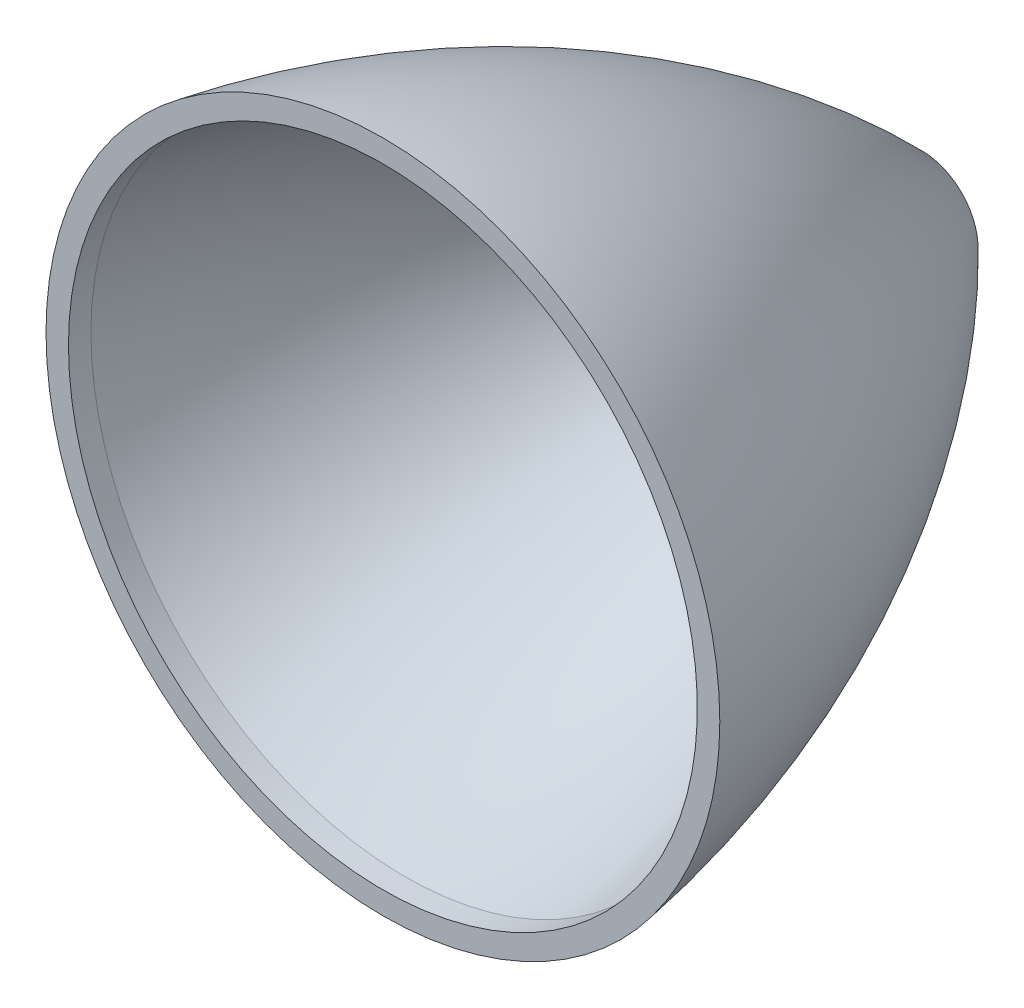
ISO-10303-21;
HEADER;
FILE_DESCRIPTION(('STEP AP214'),'2;1');
FILE_NAME('part.step','',(''),(''),'','','');
FILE_SCHEMA(('AUTOMOTIVE_DESIGN { 1 0 10303 214 1 1 1 1 }'));
ENDSEC;
DATA;
#1=APPLICATION_CONTEXT('core data for automotive mechanical design processes');
#2=APPLICATION_PROTOCOL_DEFINITION('international standard','automotive_design',2000,#1);
#3=PRODUCT_CONTEXT('',#1,'mechanical');
#4=PRODUCT('Part','Part','',(#3));
#5=PRODUCT_RELATED_PRODUCT_CATEGORY('part','',(#4));
#6=PRODUCT_DEFINITION_FORMATION('','',#4);
#7=PRODUCT_DEFINITION_CONTEXT('part definition',#1,'design');
#8=PRODUCT_DEFINITION('design','',#6,#7);
#9=PRODUCT_DEFINITION_SHAPE('','',#8);
#10=(LENGTH_UNIT() NAMED_UNIT(*) SI_UNIT(.MILLI.,.METRE.));
#11=(NAMED_UNIT(*) PLANE_ANGLE_UNIT() SI_UNIT($,.RADIAN.));
#12=(NAMED_UNIT(*) SI_UNIT($,.STERADIAN.) SOLID_ANGLE_UNIT());
#13=UNCERTAINTY_MEASURE_WITH_UNIT(LENGTH_MEASURE(1.E-05),#10,'distance_accuracy_value','');
#14=(GEOMETRIC_REPRESENTATION_CONTEXT(3) GLOBAL_UNCERTAINTY_ASSIGNED_CONTEXT((#13)) GLOBAL_UNIT_ASSIGNED_CONTEXT((#10,
#11,#12)) REPRESENTATION_CONTEXT('',''));
#15=CARTESIAN_POINT('',(0.,0.,0.));
#16=DIRECTION('',(0.,0.,1.));
#17=DIRECTION('',(1.,0.,0.));
#18=AXIS2_PLACEMENT_3D('',#15,#16,#17);
#19=CARTESIAN_POINT('',(0.,1.5,3.81018259712039));
#20=DIRECTION('',(0.,0.,1.));
#21=DIRECTION('',(1.,0.,0.));
#22=AXIS2_PLACEMENT_3D('',#19,#20,#21);
#23=PLANE('',#22);
#24=CARTESIAN_POINT('',(0.,0.,3.81018259712039));
#25=DIRECTION('',(0.,0.,-1.));
#26=DIRECTION('',(-1.,0.,0.));
#27=AXIS2_PLACEMENT_3D('',#24,#25,#26);
#28=CIRCLE('',#27,1.5);
#29=CARTESIAN_POINT('',(-1.5,0.,3.81018259712039));
#30=VERTEX_POINT('',#29);
#31=EDGE_CURVE('E36',#30,#30,#28,.T.);
#32=ORIENTED_EDGE('',*,*,#31,.T.);
#33=EDGE_LOOP('',(#32));
#34=FACE_BOUND('',#33,.T.);
#35=CARTESIAN_POINT('',(0.,0.,3.81018259712039));
#36=DIRECTION('',(0.,0.,-1.));
#37=DIRECTION('',(-1.,0.,0.));
#38=AXIS2_PLACEMENT_3D('',#35,#36,#37);
#39=CIRCLE('',#38,4.00000000000001);
#40=CARTESIAN_POINT('',(-4.00000000000001,0.,3.81018259712039));
#41=VERTEX_POINT('',#40);
#42=EDGE_CURVE('E18',#41,#41,#39,.F.);
#43=ORIENTED_EDGE('',*,*,#42,.T.);
#44=EDGE_LOOP('',(#43));
#45=FACE_BOUND('',#44,.T.);
#46=ADVANCED_FACE('F15',(#34,#45),#23,.T.);
#47=CARTESIAN_POINT('',(0.,0.,31.8359782136435));
#48=DIRECTION('',(0.,0.,-1.));
#49=DIRECTION('',(-1.,0.,0.));
#50=AXIS2_PLACEMENT_3D('',#47,#48,#49);
#51=DEGENERATE_TOROIDAL_SURFACE('',#50,26.421531561807,41.363205902168,.F.);
#52=CARTESIAN_POINT('',(0.,0.,23.0601825971204));
#53=DIRECTION('',(0.,0.,-1.));
#54=DIRECTION('',(-1.,0.,0.));
#55=AXIS2_PLACEMENT_3D('',#52,#53,#54);
#56=CIRCLE('',#55,14.);
#57=CARTESIAN_POINT('',(-14.,0.,23.0601825971204));
#58=VERTEX_POINT('',#57);
#59=EDGE_CURVE('E30',#58,#58,#56,.F.);
#60=ORIENTED_EDGE('',*,*,#59,.T.);
#61=EDGE_LOOP('',(#60));
#62=FACE_BOUND('',#61,.T.);
#63=ORIENTED_EDGE('',*,*,#42,.F.);
#64=EDGE_LOOP('',(#63));
#65=FACE_BOUND('',#64,.T.);
#66=ADVANCED_FACE('F45',(#62,#65),#51,.T.);
#67=CARTESIAN_POINT('',(0.,0.,-3.97927021276701));
#68=DIRECTION('',(0.,0.,-1.));
#69=DIRECTION('',(-1.,0.,0.));
#70=AXIS2_PLACEMENT_3D('',#67,#68,#69);
#71=CYLINDRICAL_SURFACE('',#70,1.5);
#72=CARTESIAN_POINT('',(0.,0.,0.0601825971203885));
#73=DIRECTION('',(0.,0.,-1.));
#74=DIRECTION('',(-1.,0.,0.));
#75=AXIS2_PLACEMENT_3D('',#72,#73,#74);
#76=CIRCLE('',#75,1.5);
#77=CARTESIAN_POINT('',(-1.5,0.,0.0601825971203885));
#78=VERTEX_POINT('',#77);
#79=EDGE_CURVE('E34',#78,#78,#76,.F.);
#80=ORIENTED_EDGE('',*,*,#79,.F.);
#81=EDGE_LOOP('',(#80));
#82=FACE_BOUND('',#81,.T.);
#83=ORIENTED_EDGE('',*,*,#31,.F.);
#84=EDGE_LOOP('',(#83));
#85=FACE_BOUND('',#84,.T.);
#86=ADVANCED_FACE('F47',(#82,#85),#71,.F.);
#87=CARTESIAN_POINT('',(0.,0.,-3.97927021276701));
#88=DIRECTION('',(0.,0.,-1.));
#89=DIRECTION('',(-1.,0.,0.));
#90=AXIS2_PLACEMENT_3D('',#87,#88,#89);
#91=CYLINDRICAL_SURFACE('',#90,14.);
#92=ORIENTED_EDGE('',*,*,#59,.F.);
#93=EDGE_LOOP('',(#92));
#94=FACE_BOUND('',#93,.T.);
#95=CARTESIAN_POINT('',(0.,0.,24.0601825971204));
#96=DIRECTION('',(0.,0.,-1.));
#97=DIRECTION('',(-1.,0.,0.));
#98=AXIS2_PLACEMENT_3D('',#95,#96,#97);
#99=CIRCLE('',#98,14.);
#100=CARTESIAN_POINT('',(-14.,0.,24.0601825971204));
#101=VERTEX_POINT('',#100);
#102=EDGE_CURVE('E27',#101,#101,#99,.T.);
#103=ORIENTED_EDGE('',*,*,#102,.F.);
#104=EDGE_LOOP('',(#103));
#105=FACE_BOUND('',#104,.T.);
#106=ADVANCED_FACE('F54',(#94,#105),#91,.F.);
#107=CARTESIAN_POINT('',(0.,1.5,0.0601825971203885));
#108=DIRECTION('',(0.,0.,-1.));
#109=DIRECTION('',(-1.,0.,0.));
#110=AXIS2_PLACEMENT_3D('',#107,#108,#109);
#111=PLANE('',#110);
#112=ORIENTED_EDGE('',*,*,#79,.T.);
#113=EDGE_LOOP('',(#112));
#114=FACE_BOUND('',#113,.T.);
#115=CARTESIAN_POINT('',(0.,0.,0.0601825971204249));
#116=DIRECTION('',(0.,0.,-1.));
#117=DIRECTION('',(-1.,0.,0.));
#118=AXIS2_PLACEMENT_3D('',#115,#116,#117);
#119=CIRCLE('',#118,2.49999999999997);
#120=CARTESIAN_POINT('',(-2.49999999999997,0.,0.0601825971204249));
#121=VERTEX_POINT('',#120);
#122=EDGE_CURVE('E22',#121,#121,#119,.F.);
#123=ORIENTED_EDGE('',*,*,#122,.F.);
#124=EDGE_LOOP('',(#123));
#125=FACE_BOUND('',#124,.T.);
#126=ADVANCED_FACE('F64',(#114,#125),#111,.T.);
#127=CARTESIAN_POINT('',(0.,14.,24.0601825971204));
#128=DIRECTION('',(0.,0.,1.));
#129=DIRECTION('',(1.,0.,0.));
#130=AXIS2_PLACEMENT_3D('',#127,#128,#129);
#131=PLANE('',#130);
#132=ORIENTED_EDGE('',*,*,#102,.T.);
#133=EDGE_LOOP('',(#132));
#134=FACE_BOUND('',#133,.T.);
#135=CARTESIAN_POINT('',(0.,0.,24.0601825971204));
#136=DIRECTION('',(0.,0.,-1.));
#137=DIRECTION('',(-1.,0.,0.));
#138=AXIS2_PLACEMENT_3D('',#135,#136,#137);
#139=CIRCLE('',#138,15.);
#140=CARTESIAN_POINT('',(-15.,0.,24.0601825971204));
#141=VERTEX_POINT('',#140);
#142=EDGE_CURVE('E10',#141,#141,#139,.T.);
#143=ORIENTED_EDGE('',*,*,#142,.F.);
#144=EDGE_LOOP('',(#143));
#145=FACE_BOUND('',#144,.T.);
#146=ADVANCED_FACE('F59',(#134,#145),#131,.T.);
#147=CARTESIAN_POINT('',(0.,0.,31.1104339021616));
#148=DIRECTION('',(0.,0.,-1.));
#149=DIRECTION('',(-1.,0.,0.));
#150=AXIS2_PLACEMENT_3D('',#147,#148,#149);
#151=DEGENERATE_TOROIDAL_SURFACE('',#150,27.8264825056791,43.4029221052393,.F.);
#152=ORIENTED_EDGE('',*,*,#142,.T.);
#153=EDGE_LOOP('',(#152));
#154=FACE_BOUND('',#153,.T.);
#155=ORIENTED_EDGE('',*,*,#122,.T.);
#156=EDGE_LOOP('',(#155));
#157=FACE_BOUND('',#156,.T.);
#158=ADVANCED_FACE('F57',(#154,#157),#151,.F.);
#159=CLOSED_SHELL('',(#46,#66,#86,#106,#126,#146,#158));
#160=MANIFOLD_SOLID_BREP('B1',#159);
#161=ADVANCED_BREP_SHAPE_REPRESENTATION('',(#18,#160),#14);
#162=SHAPE_DEFINITION_REPRESENTATION(#9,#161);
ENDSEC;
END-ISO-10303-21;
